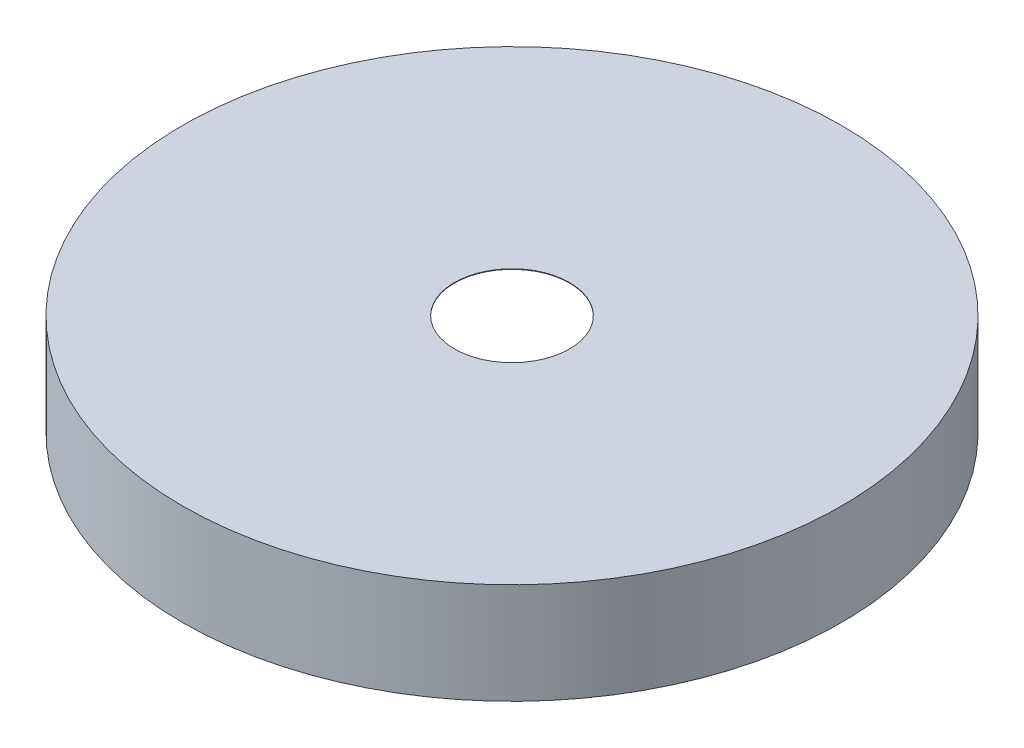
ISO-10303-21;
HEADER;
FILE_DESCRIPTION(('STEP AP214'),'2;1');
FILE_NAME('part.step','',(''),(''),'','','');
FILE_SCHEMA(('AUTOMOTIVE_DESIGN { 1 0 10303 214 1 1 1 1 }'));
ENDSEC;
DATA;
#1=APPLICATION_CONTEXT('core data for automotive mechanical design processes');
#2=APPLICATION_PROTOCOL_DEFINITION('international standard','automotive_design',2000,#1);
#3=PRODUCT_CONTEXT('',#1,'mechanical');
#4=PRODUCT('Part','Part','',(#3));
#5=PRODUCT_RELATED_PRODUCT_CATEGORY('part','',(#4));
#6=PRODUCT_DEFINITION_FORMATION('','',#4);
#7=PRODUCT_DEFINITION_CONTEXT('part definition',#1,'design');
#8=PRODUCT_DEFINITION('design','',#6,#7);
#9=PRODUCT_DEFINITION_SHAPE('','',#8);
#10=(LENGTH_UNIT() NAMED_UNIT(*) SI_UNIT(.MILLI.,.METRE.));
#11=(NAMED_UNIT(*) PLANE_ANGLE_UNIT() SI_UNIT($,.RADIAN.));
#12=(NAMED_UNIT(*) SI_UNIT($,.STERADIAN.) SOLID_ANGLE_UNIT());
#13=UNCERTAINTY_MEASURE_WITH_UNIT(LENGTH_MEASURE(1.E-05),#10,'distance_accuracy_value','');
#14=(GEOMETRIC_REPRESENTATION_CONTEXT(3) GLOBAL_UNCERTAINTY_ASSIGNED_CONTEXT((#13)) GLOBAL_UNIT_ASSIGNED_CONTEXT((#10,
#11,#12)) REPRESENTATION_CONTEXT('',''));
#15=CARTESIAN_POINT('',(0.,0.,0.));
#16=DIRECTION('',(0.,0.,1.));
#17=DIRECTION('',(1.,0.,0.));
#18=AXIS2_PLACEMENT_3D('',#15,#16,#17);
#19=CARTESIAN_POINT('',(0.,-2.54000000000002,0.));
#20=DIRECTION('',(0.,-1.,0.));
#21=DIRECTION('',(0.,0.,-1.));
#22=AXIS2_PLACEMENT_3D('',#19,#20,#21);
#23=CYLINDRICAL_SURFACE('',#22,157.48);
#24=CARTESIAN_POINT('',(0.,48.768,0.));
#25=DIRECTION('',(0.,-1.,0.));
#26=DIRECTION('',(0.,0.,-1.));
#27=AXIS2_PLACEMENT_3D('',#24,#25,#26);
#28=CIRCLE('',#27,157.48);
#29=CARTESIAN_POINT('',(0.,48.768,-157.48));
#30=VERTEX_POINT('',#29);
#31=EDGE_CURVE('E10',#30,#30,#28,.T.);
#32=ORIENTED_EDGE('',*,*,#31,.F.);
#33=EDGE_LOOP('',(#32));
#34=FACE_BOUND('',#33,.T.);
#35=CARTESIAN_POINT('',(0.,0.,0.));
#36=DIRECTION('',(0.,-1.,0.));
#37=DIRECTION('',(0.,0.,-1.));
#38=AXIS2_PLACEMENT_3D('',#35,#36,#37);
#39=CIRCLE('',#38,157.48);
#40=CARTESIAN_POINT('',(0.,0.,-157.48));
#41=VERTEX_POINT('',#40);
#42=EDGE_CURVE('E53',#41,#41,#39,.T.);
#43=ORIENTED_EDGE('',*,*,#42,.T.);
#44=EDGE_LOOP('',(#43));
#45=FACE_BOUND('',#44,.T.);
#46=ADVANCED_FACE('F31',(#34,#45),#23,.F.);
#47=CARTESIAN_POINT('',(-27.94,48.768,0.));
#48=DIRECTION('',(0.,1.,0.));
#49=DIRECTION('',(0.,0.,1.));
#50=AXIS2_PLACEMENT_3D('',#47,#48,#49);
#51=PLANE('',#50);
#52=CARTESIAN_POINT('',(0.,48.768,0.));
#53=DIRECTION('',(0.,-1.,0.));
#54=DIRECTION('',(0.,0.,-1.));
#55=AXIS2_PLACEMENT_3D('',#52,#53,#54);
#56=CIRCLE('',#55,27.94);
#57=CARTESIAN_POINT('',(0.,48.768,-27.94));
#58=VERTEX_POINT('',#57);
#59=EDGE_CURVE('E37',#58,#58,#56,.T.);
#60=ORIENTED_EDGE('',*,*,#59,.F.);
#61=EDGE_LOOP('',(#60));
#62=FACE_BOUND('',#61,.T.);
#63=ORIENTED_EDGE('',*,*,#31,.T.);
#64=EDGE_LOOP('',(#63));
#65=FACE_BOUND('',#64,.T.);
#66=ADVANCED_FACE('F78',(#62,#65),#51,.F.);
#67=CARTESIAN_POINT('',(0.,-2.54000000000002,0.));
#68=DIRECTION('',(0.,-1.,0.));
#69=DIRECTION('',(0.,0.,-1.));
#70=AXIS2_PLACEMENT_3D('',#67,#68,#69);
#71=CYLINDRICAL_SURFACE('',#70,27.94);
#72=CARTESIAN_POINT('',(0.,49.022,0.));
#73=DIRECTION('',(0.,-1.,0.));
#74=DIRECTION('',(0.,0.,-1.));
#75=AXIS2_PLACEMENT_3D('',#72,#73,#74);
#76=CIRCLE('',#75,27.94);
#77=CARTESIAN_POINT('',(0.,49.022,-27.94));
#78=VERTEX_POINT('',#77);
#79=EDGE_CURVE('E41',#78,#78,#76,.T.);
#80=ORIENTED_EDGE('',*,*,#79,.F.);
#81=EDGE_LOOP('',(#80));
#82=FACE_BOUND('',#81,.T.);
#83=ORIENTED_EDGE('',*,*,#59,.T.);
#84=EDGE_LOOP('',(#83));
#85=FACE_BOUND('',#84,.T.);
#86=ADVANCED_FACE('F73',(#82,#85),#71,.F.);
#87=CARTESIAN_POINT('',(-160.02,49.022,0.));
#88=DIRECTION('',(0.,-1.,0.));
#89=DIRECTION('',(0.,0.,-1.));
#90=AXIS2_PLACEMENT_3D('',#87,#88,#89);
#91=PLANE('',#90);
#92=CARTESIAN_POINT('',(0.,49.022,0.));
#93=DIRECTION('',(0.,-1.,0.));
#94=DIRECTION('',(0.,0.,-1.));
#95=AXIS2_PLACEMENT_3D('',#92,#93,#94);
#96=CIRCLE('',#95,160.02);
#97=CARTESIAN_POINT('',(0.,49.022,-160.02));
#98=VERTEX_POINT('',#97);
#99=EDGE_CURVE('E45',#98,#98,#96,.T.);
#100=ORIENTED_EDGE('',*,*,#99,.F.);
#101=EDGE_LOOP('',(#100));
#102=FACE_BOUND('',#101,.T.);
#103=ORIENTED_EDGE('',*,*,#79,.T.);
#104=EDGE_LOOP('',(#103));
#105=FACE_BOUND('',#104,.T.);
#106=ADVANCED_FACE('F67',(#102,#105),#91,.F.);
#107=CARTESIAN_POINT('',(0.,-2.54000000000002,0.));
#108=DIRECTION('',(0.,-1.,0.));
#109=DIRECTION('',(0.,0.,-1.));
#110=AXIS2_PLACEMENT_3D('',#107,#108,#109);
#111=CYLINDRICAL_SURFACE('',#110,160.02);
#112=CARTESIAN_POINT('',(0.,0.,0.));
#113=DIRECTION('',(0.,-1.,0.));
#114=DIRECTION('',(0.,0.,-1.));
#115=AXIS2_PLACEMENT_3D('',#112,#113,#114);
#116=CIRCLE('',#115,160.02);
#117=CARTESIAN_POINT('',(0.,0.,-160.02));
#118=VERTEX_POINT('',#117);
#119=EDGE_CURVE('E50',#118,#118,#116,.T.);
#120=ORIENTED_EDGE('',*,*,#119,.F.);
#121=EDGE_LOOP('',(#120));
#122=FACE_BOUND('',#121,.T.);
#123=ORIENTED_EDGE('',*,*,#99,.T.);
#124=EDGE_LOOP('',(#123));
#125=FACE_BOUND('',#124,.T.);
#126=ADVANCED_FACE('F61',(#122,#125),#111,.T.);
#127=CARTESIAN_POINT('',(-157.48,0.,0.));
#128=DIRECTION('',(0.,1.,0.));
#129=DIRECTION('',(0.,0.,1.));
#130=AXIS2_PLACEMENT_3D('',#127,#128,#129);
#131=PLANE('',#130);
#132=ORIENTED_EDGE('',*,*,#42,.F.);
#133=EDGE_LOOP('',(#132));
#134=FACE_BOUND('',#133,.T.);
#135=ORIENTED_EDGE('',*,*,#119,.T.);
#136=EDGE_LOOP('',(#135));
#137=FACE_BOUND('',#136,.T.);
#138=ADVANCED_FACE('F58',(#134,#137),#131,.F.);
#139=CLOSED_SHELL('',(#46,#66,#86,#106,#126,#138));
#140=MANIFOLD_SOLID_BREP('B2',#139);
#141=ADVANCED_BREP_SHAPE_REPRESENTATION('',(#18,#140),#14);
#142=SHAPE_DEFINITION_REPRESENTATION(#9,#141);
ENDSEC;
END-ISO-10303-21;
